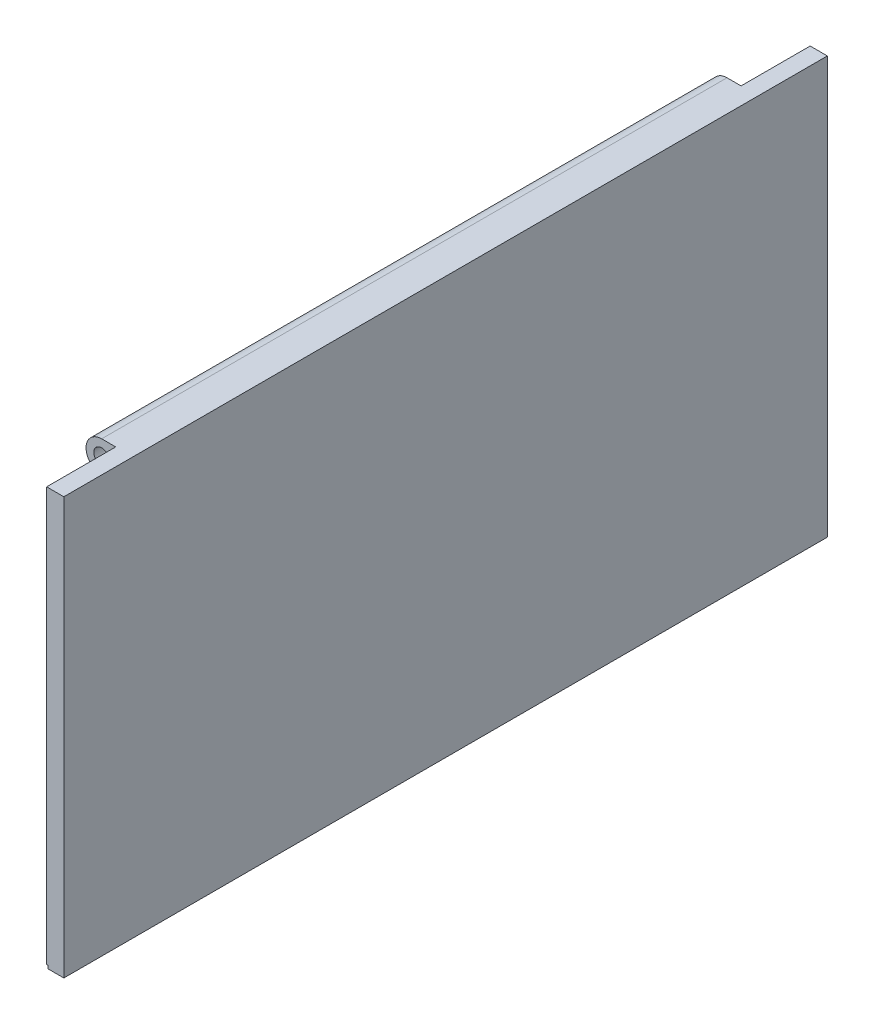
ISO-10303-21;
HEADER;
FILE_DESCRIPTION(('STEP AP214'),'2;1');
FILE_NAME('part.step','',(''),(''),'','','');
FILE_SCHEMA(('AUTOMOTIVE_DESIGN { 1 0 10303 214 1 1 1 1 }'));
ENDSEC;
DATA;
#1=APPLICATION_CONTEXT('core data for automotive mechanical design processes');
#2=APPLICATION_PROTOCOL_DEFINITION('international standard','automotive_design',2000,#1);
#3=PRODUCT_CONTEXT('',#1,'mechanical');
#4=PRODUCT('Part','Part','',(#3));
#5=PRODUCT_RELATED_PRODUCT_CATEGORY('part','',(#4));
#6=PRODUCT_DEFINITION_FORMATION('','',#4);
#7=PRODUCT_DEFINITION_CONTEXT('part definition',#1,'design');
#8=PRODUCT_DEFINITION('design','',#6,#7);
#9=PRODUCT_DEFINITION_SHAPE('','',#8);
#10=(LENGTH_UNIT() NAMED_UNIT(*) SI_UNIT(.MILLI.,.METRE.));
#11=(NAMED_UNIT(*) PLANE_ANGLE_UNIT() SI_UNIT($,.RADIAN.));
#12=(NAMED_UNIT(*) SI_UNIT($,.STERADIAN.) SOLID_ANGLE_UNIT());
#13=UNCERTAINTY_MEASURE_WITH_UNIT(LENGTH_MEASURE(1.E-05),#10,'distance_accuracy_value','');
#14=(GEOMETRIC_REPRESENTATION_CONTEXT(3) GLOBAL_UNCERTAINTY_ASSIGNED_CONTEXT((#13)) GLOBAL_UNIT_ASSIGNED_CONTEXT((#10,
#11,#12)) REPRESENTATION_CONTEXT('',''));
#15=CARTESIAN_POINT('',(0.,0.,0.));
#16=DIRECTION('',(0.,0.,1.));
#17=DIRECTION('',(1.,0.,0.));
#18=AXIS2_PLACEMENT_3D('',#15,#16,#17);
#19=CARTESIAN_POINT('',(0.,2.5,111.05));
#20=DIRECTION('',(0.,-1.,0.));
#21=DIRECTION('',(0.,0.,-1.));
#22=AXIS2_PLACEMENT_3D('',#19,#20,#21);
#23=PLANE('',#22);
#24=DIRECTION('',(-1.,0.,0.));
#25=VECTOR('',#24,1.);
#26=CARTESIAN_POINT('',(0.,2.5,100.));
#27=LINE('',#26,#25);
#28=CARTESIAN_POINT('',(2.25,2.5,100.));
#29=VERTEX_POINT('',#28);
#30=CARTESIAN_POINT('',(0.,2.5,100.));
#31=VERTEX_POINT('',#30);
#32=EDGE_CURVE('E148',#29,#31,#27,.T.);
#33=ORIENTED_EDGE('',*,*,#32,.F.);
#34=DIRECTION('',(0.,0.,1.));
#35=VECTOR('',#34,1.);
#36=CARTESIAN_POINT('',(2.25,2.5,-77.2571370775085));
#37=LINE('',#36,#35);
#38=CARTESIAN_POINT('',(2.25,2.5,111.05));
#39=VERTEX_POINT('',#38);
#40=EDGE_CURVE('E144',#29,#39,#37,.T.);
#41=ORIENTED_EDGE('',*,*,#40,.T.);
#42=DIRECTION('',(-1.,0.,0.));
#43=VECTOR('',#42,1.);
#44=CARTESIAN_POINT('',(0.,2.5,111.05));
#45=LINE('',#44,#43);
#46=CARTESIAN_POINT('',(5.,2.5,111.05));
#47=VERTEX_POINT('',#46);
#48=EDGE_CURVE('E166',#47,#39,#45,.T.);
#49=ORIENTED_EDGE('',*,*,#48,.F.);
#50=DIRECTION('',(0.,0.,-1.));
#51=VECTOR('',#50,1.);
#52=CARTESIAN_POINT('',(5.,2.5,111.05));
#53=LINE('',#52,#51);
#54=CARTESIAN_POINT('',(5.,2.5,-11.05));
#55=VERTEX_POINT('',#54);
#56=EDGE_CURVE('E168',#47,#55,#53,.T.);
#57=ORIENTED_EDGE('',*,*,#56,.T.);
#58=DIRECTION('',(-1.,0.,0.));
#59=VECTOR('',#58,1.);
#60=CARTESIAN_POINT('',(0.,2.5,-11.05));
#61=LINE('',#60,#59);
#62=CARTESIAN_POINT('',(2.25,2.5,-11.05));
#63=VERTEX_POINT('',#62);
#64=EDGE_CURVE('E162',#55,#63,#61,.T.);
#65=ORIENTED_EDGE('',*,*,#64,.T.);
#66=CARTESIAN_POINT('',(2.25,2.5,0.));
#67=VERTEX_POINT('',#66);
#68=EDGE_CURVE('E293',#63,#67,#37,.T.);
#69=ORIENTED_EDGE('',*,*,#68,.T.);
#70=DIRECTION('',(-1.,0.,0.));
#71=VECTOR('',#70,1.);
#72=CARTESIAN_POINT('',(0.,2.5,0.));
#73=LINE('',#72,#71);
#74=CARTESIAN_POINT('',(0.,2.5,0.));
#75=VERTEX_POINT('',#74);
#76=EDGE_CURVE('E202',#67,#75,#73,.T.);
#77=ORIENTED_EDGE('',*,*,#76,.T.);
#78=DIRECTION('',(0.,0.,-1.));
#79=VECTOR('',#78,1.);
#80=CARTESIAN_POINT('',(0.,2.5,100.));
#81=LINE('',#80,#79);
#82=EDGE_CURVE('E194',#31,#75,#81,.T.);
#83=ORIENTED_EDGE('',*,*,#82,.F.);
#84=EDGE_LOOP('',(#33,#41,#49,#57,#65,#69,#77,#83));
#85=FACE_BOUND('',#84,.T.);
#86=ADVANCED_FACE('F39',(#85),#23,.F.);
#87=CARTESIAN_POINT('',(0.,-2.5,111.05));
#88=DIRECTION('',(0.,1.,0.));
#89=DIRECTION('',(0.,0.,1.));
#90=AXIS2_PLACEMENT_3D('',#87,#88,#89);
#91=PLANE('',#90);
#92=DIRECTION('',(-1.,0.,0.));
#93=VECTOR('',#92,1.);
#94=CARTESIAN_POINT('',(2.5,-2.5,0.));
#95=LINE('',#94,#93);
#96=CARTESIAN_POINT('',(0.804642195809896,-2.5,0.));
#97=VERTEX_POINT('',#96);
#98=CARTESIAN_POINT('',(0.,-2.5,0.));
#99=VERTEX_POINT('',#98);
#100=EDGE_CURVE('E156',#97,#99,#95,.T.);
#101=ORIENTED_EDGE('',*,*,#100,.F.);
#102=DIRECTION('',(0.,0.,1.));
#103=VECTOR('',#102,1.);
#104=CARTESIAN_POINT('',(0.804642195809896,-2.5,111.05));
#105=LINE('',#104,#103);
#106=CARTESIAN_POINT('',(0.804642195809896,-2.5,100.));
#107=VERTEX_POINT('',#106);
#108=EDGE_CURVE('E206',#97,#107,#105,.T.);
#109=ORIENTED_EDGE('',*,*,#108,.T.);
#110=DIRECTION('',(1.,0.,0.));
#111=VECTOR('',#110,1.);
#112=CARTESIAN_POINT('',(2.5,-2.5,100.));
#113=LINE('',#112,#111);
#114=CARTESIAN_POINT('',(0.,-2.5,100.));
#115=VERTEX_POINT('',#114);
#116=EDGE_CURVE('E145',#115,#107,#113,.T.);
#117=ORIENTED_EDGE('',*,*,#116,.F.);
#118=DIRECTION('',(0.,0.,-1.));
#119=VECTOR('',#118,1.);
#120=CARTESIAN_POINT('',(0.,-2.5,100.));
#121=LINE('',#120,#119);
#122=EDGE_CURVE('E199',#115,#99,#121,.T.);
#123=ORIENTED_EDGE('',*,*,#122,.T.);
#124=EDGE_LOOP('',(#101,#109,#117,#123));
#125=FACE_BOUND('',#124,.T.);
#126=ADVANCED_FACE('F212',(#125),#91,.F.);
#127=CARTESIAN_POINT('',(0.,0.,111.05));
#128=DIRECTION('',(0.,0.,1.));
#129=DIRECTION('',(1.,0.,0.));
#130=AXIS2_PLACEMENT_3D('',#127,#128,#129);
#131=PLANE('',#130);
#132=DIRECTION('',(0.,1.,0.));
#133=VECTOR('',#132,1.);
#134=CARTESIAN_POINT('',(5.,2.5,111.05));
#135=LINE('',#134,#133);
#136=CARTESIAN_POINT('',(5.00000000000001,-64.15,111.05));
#137=VERTEX_POINT('',#136);
#138=EDGE_CURVE('E164',#137,#47,#135,.T.);
#139=ORIENTED_EDGE('',*,*,#138,.T.);
#140=ORIENTED_EDGE('',*,*,#48,.T.);
#141=DIRECTION('',(0.,-1.,0.));
#142=VECTOR('',#141,1.);
#143=CARTESIAN_POINT('',(2.25,2.5,111.05));
#144=LINE('',#143,#142);
#145=CARTESIAN_POINT('',(2.25000000000001,-63.65,111.05));
#146=VERTEX_POINT('',#145);
#147=EDGE_CURVE('E288',#39,#146,#144,.T.);
#148=ORIENTED_EDGE('',*,*,#147,.T.);
#149=DIRECTION('',(1.,0.,0.));
#150=VECTOR('',#149,1.);
#151=CARTESIAN_POINT('',(5.,-63.65,111.05));
#152=LINE('',#151,#150);
#153=CARTESIAN_POINT('',(2.50000000000001,-63.65,111.05));
#154=VERTEX_POINT('',#153);
#155=EDGE_CURVE('E291',#146,#154,#152,.T.);
#156=ORIENTED_EDGE('',*,*,#155,.T.);
#157=DIRECTION('',(0.,-1.,0.));
#158=VECTOR('',#157,1.);
#159=CARTESIAN_POINT('',(2.5,-2.5,111.05));
#160=LINE('',#159,#158);
#161=CARTESIAN_POINT('',(2.50000000000001,-64.15,111.05));
#162=VERTEX_POINT('',#161);
#163=EDGE_CURVE('E159',#154,#162,#160,.T.);
#164=ORIENTED_EDGE('',*,*,#163,.T.);
#165=DIRECTION('',(1.,0.,0.));
#166=VECTOR('',#165,1.);
#167=CARTESIAN_POINT('',(2.50000000000001,-64.15,111.05));
#168=LINE('',#167,#166);
#169=EDGE_CURVE('E161',#162,#137,#168,.T.);
#170=ORIENTED_EDGE('',*,*,#169,.T.);
#171=EDGE_LOOP('',(#139,#140,#148,#156,#164,#170));
#172=FACE_BOUND('',#171,.T.);
#173=ADVANCED_FACE('F237',(#172),#131,.T.);
#174=CARTESIAN_POINT('',(0.,0.,-11.05));
#175=DIRECTION('',(0.,0.,1.));
#176=DIRECTION('',(1.,0.,0.));
#177=AXIS2_PLACEMENT_3D('',#174,#175,#176);
#178=PLANE('',#177);
#179=DIRECTION('',(0.,-1.,0.));
#180=VECTOR('',#179,1.);
#181=CARTESIAN_POINT('',(2.5,-2.5,-11.05));
#182=LINE('',#181,#180);
#183=CARTESIAN_POINT('',(2.5,-63.65,-11.05));
#184=VERTEX_POINT('',#183);
#185=CARTESIAN_POINT('',(2.50000000000001,-64.15,-11.05));
#186=VERTEX_POINT('',#185);
#187=EDGE_CURVE('E158',#184,#186,#182,.T.);
#188=ORIENTED_EDGE('',*,*,#187,.F.);
#189=DIRECTION('',(-1.,0.,0.));
#190=VECTOR('',#189,1.);
#191=CARTESIAN_POINT('',(5.,-63.65,-11.05));
#192=LINE('',#191,#190);
#193=CARTESIAN_POINT('',(2.25000000000001,-63.65,-11.05));
#194=VERTEX_POINT('',#193);
#195=EDGE_CURVE('E151',#184,#194,#192,.T.);
#196=ORIENTED_EDGE('',*,*,#195,.T.);
#197=DIRECTION('',(0.,1.,0.));
#198=VECTOR('',#197,1.);
#199=CARTESIAN_POINT('',(2.25,2.5,-11.05));
#200=LINE('',#199,#198);
#201=EDGE_CURVE('E283',#194,#63,#200,.T.);
#202=ORIENTED_EDGE('',*,*,#201,.T.);
#203=ORIENTED_EDGE('',*,*,#64,.F.);
#204=DIRECTION('',(0.,1.,0.));
#205=VECTOR('',#204,1.);
#206=CARTESIAN_POINT('',(5.,2.5,-11.05));
#207=LINE('',#206,#205);
#208=CARTESIAN_POINT('',(5.00000000000001,-64.15,-11.05));
#209=VERTEX_POINT('',#208);
#210=EDGE_CURVE('E172',#209,#55,#207,.T.);
#211=ORIENTED_EDGE('',*,*,#210,.F.);
#212=DIRECTION('',(1.,0.,0.));
#213=VECTOR('',#212,1.);
#214=CARTESIAN_POINT('',(2.50000000000001,-64.15,-11.05));
#215=LINE('',#214,#213);
#216=EDGE_CURVE('E170',#186,#209,#215,.T.);
#217=ORIENTED_EDGE('',*,*,#216,.F.);
#218=EDGE_LOOP('',(#188,#196,#202,#203,#211,#217));
#219=FACE_BOUND('',#218,.T.);
#220=ADVANCED_FACE('F241',(#219),#178,.F.);
#221=CARTESIAN_POINT('',(0.,0.,100.));
#222=DIRECTION('',(0.,0.,-1.));
#223=DIRECTION('',(-1.,0.,0.));
#224=AXIS2_PLACEMENT_3D('',#221,#222,#223);
#225=CYLINDRICAL_SURFACE('',#224,2.5);
#226=ORIENTED_EDGE('',*,*,#122,.F.);
#227=CARTESIAN_POINT('',(0.,0.,100.));
#228=DIRECTION('',(0.,0.,1.));
#229=DIRECTION('',(1.,0.,0.));
#230=AXIS2_PLACEMENT_3D('',#227,#228,#229);
#231=CIRCLE('',#230,2.5);
#232=EDGE_CURVE('E191',#31,#115,#231,.T.);
#233=ORIENTED_EDGE('',*,*,#232,.F.);
#234=ORIENTED_EDGE('',*,*,#82,.T.);
#235=CARTESIAN_POINT('',(0.,0.,0.));
#236=DIRECTION('',(0.,0.,1.));
#237=DIRECTION('',(1.,0.,0.));
#238=AXIS2_PLACEMENT_3D('',#235,#236,#237);
#239=CIRCLE('',#238,2.5);
#240=EDGE_CURVE('E188',#75,#99,#239,.T.);
#241=ORIENTED_EDGE('',*,*,#240,.T.);
#242=EDGE_LOOP('',(#226,#233,#234,#241));
#243=FACE_BOUND('',#242,.T.);
#244=ADVANCED_FACE('F219',(#243),#225,.T.);
#245=CARTESIAN_POINT('',(0.,0.,100.));
#246=DIRECTION('',(0.,0.,1.));
#247=DIRECTION('',(1.,0.,0.));
#248=AXIS2_PLACEMENT_3D('',#245,#246,#247);
#249=PLANE('',#248);
#250=ORIENTED_EDGE('',*,*,#116,.T.);
#251=CARTESIAN_POINT('',(0.804642195809896,-0.5,100.));
#252=DIRECTION('',(0.,0.,1.));
#253=DIRECTION('',(1.,0.,0.));
#254=AXIS2_PLACEMENT_3D('',#251,#252,#253);
#255=CIRCLE('',#254,2.);
#256=CARTESIAN_POINT('',(2.20271594078655,-1.93017124974842,100.));
#257=VERTEX_POINT('',#256);
#258=EDGE_CURVE('E61',#107,#257,#255,.T.);
#259=ORIENTED_EDGE('',*,*,#258,.T.);
#260=DIRECTION('',(-0.715085624874211,-0.699036872488326,0.));
#261=VECTOR('',#260,1.);
#262=CARTESIAN_POINT('',(2.25,-1.88394839234314,100.));
#263=LINE('',#262,#261);
#264=CARTESIAN_POINT('',(2.25,-1.88394839234314,100.));
#265=VERTEX_POINT('',#264);
#266=EDGE_CURVE('E127',#265,#257,#263,.T.);
#267=ORIENTED_EDGE('',*,*,#266,.F.);
#268=DIRECTION('',(0.,-1.,0.));
#269=VECTOR('',#268,1.);
#270=CARTESIAN_POINT('',(2.25,0.,100.));
#271=LINE('',#270,#269);
#272=EDGE_CURVE('E136',#29,#265,#271,.T.);
#273=ORIENTED_EDGE('',*,*,#272,.F.);
#274=ORIENTED_EDGE('',*,*,#32,.T.);
#275=ORIENTED_EDGE('',*,*,#232,.T.);
#276=EDGE_LOOP('',(#250,#259,#267,#273,#274,#275));
#277=FACE_BOUND('',#276,.T.);
#278=CARTESIAN_POINT('',(0.,0.,100.));
#279=DIRECTION('',(0.,0.,1.));
#280=DIRECTION('',(1.,0.,0.));
#281=AXIS2_PLACEMENT_3D('',#278,#279,#280);
#282=CIRCLE('',#281,1.25);
#283=CARTESIAN_POINT('',(1.25,0.,100.));
#284=VERTEX_POINT('',#283);
#285=EDGE_CURVE('E185',#284,#284,#282,.T.);
#286=ORIENTED_EDGE('',*,*,#285,.F.);
#287=EDGE_LOOP('',(#286));
#288=FACE_BOUND('',#287,.T.);
#289=ADVANCED_FACE('F134',(#277,#288),#249,.T.);
#290=CARTESIAN_POINT('',(0.,0.,0.));
#291=DIRECTION('',(0.,0.,1.));
#292=DIRECTION('',(1.,0.,0.));
#293=AXIS2_PLACEMENT_3D('',#290,#291,#292);
#294=PLANE('',#293);
#295=DIRECTION('',(-0.715085624874211,-0.699036872488326,0.));
#296=VECTOR('',#295,1.);
#297=CARTESIAN_POINT('',(2.04119981445789,-2.08806245029531,0.));
#298=LINE('',#297,#296);
#299=CARTESIAN_POINT('',(2.25,-1.88394839234314,0.));
#300=VERTEX_POINT('',#299);
#301=CARTESIAN_POINT('',(2.20271594078655,-1.93017124974842,0.));
#302=VERTEX_POINT('',#301);
#303=EDGE_CURVE('E128',#300,#302,#298,.T.);
#304=ORIENTED_EDGE('',*,*,#303,.T.);
#305=CARTESIAN_POINT('',(0.804642195809896,-0.5,0.));
#306=DIRECTION('',(0.,0.,1.));
#307=DIRECTION('',(1.,0.,0.));
#308=AXIS2_PLACEMENT_3D('',#305,#306,#307);
#309=CIRCLE('',#308,2.);
#310=EDGE_CURVE('E11',#302,#97,#309,.F.);
#311=ORIENTED_EDGE('',*,*,#310,.T.);
#312=ORIENTED_EDGE('',*,*,#100,.T.);
#313=ORIENTED_EDGE('',*,*,#240,.F.);
#314=ORIENTED_EDGE('',*,*,#76,.F.);
#315=DIRECTION('',(0.,-1.,0.));
#316=VECTOR('',#315,1.);
#317=CARTESIAN_POINT('',(2.25,0.,0.));
#318=LINE('',#317,#316);
#319=EDGE_CURVE('E204',#67,#300,#318,.T.);
#320=ORIENTED_EDGE('',*,*,#319,.T.);
#321=EDGE_LOOP('',(#304,#311,#312,#313,#314,#320));
#322=FACE_BOUND('',#321,.T.);
#323=CARTESIAN_POINT('',(0.,0.,0.));
#324=DIRECTION('',(0.,0.,1.));
#325=DIRECTION('',(1.,0.,0.));
#326=AXIS2_PLACEMENT_3D('',#323,#324,#325);
#327=CIRCLE('',#326,1.25);
#328=CARTESIAN_POINT('',(1.25,0.,0.));
#329=VERTEX_POINT('',#328);
#330=EDGE_CURVE('E184',#329,#329,#327,.T.);
#331=ORIENTED_EDGE('',*,*,#330,.T.);
#332=EDGE_LOOP('',(#331));
#333=FACE_BOUND('',#332,.T.);
#334=ADVANCED_FACE('F222',(#322,#333),#294,.F.);
#335=CARTESIAN_POINT('',(0.,0.,100.));
#336=DIRECTION('',(0.,0.,-1.));
#337=DIRECTION('',(-1.,0.,0.));
#338=AXIS2_PLACEMENT_3D('',#335,#336,#337);
#339=CYLINDRICAL_SURFACE('',#338,1.25);
#340=ORIENTED_EDGE('',*,*,#285,.T.);
#341=EDGE_LOOP('',(#340));
#342=FACE_BOUND('',#341,.T.);
#343=ORIENTED_EDGE('',*,*,#330,.F.);
#344=EDGE_LOOP('',(#343));
#345=FACE_BOUND('',#344,.T.);
#346=ADVANCED_FACE('F254',(#342,#345),#339,.F.);
#347=CARTESIAN_POINT('',(2.5,-2.5,111.05));
#348=DIRECTION('',(1.,0.,0.));
#349=DIRECTION('',(0.,1.,0.));
#350=AXIS2_PLACEMENT_3D('',#347,#348,#349);
#351=PLANE('',#350);
#352=ORIENTED_EDGE('',*,*,#163,.F.);
#353=DIRECTION('',(0.,0.,-1.));
#354=VECTOR('',#353,1.);
#355=CARTESIAN_POINT('',(2.50000000000001,-63.65,111.05));
#356=LINE('',#355,#354);
#357=EDGE_CURVE('E146',#154,#184,#356,.T.);
#358=ORIENTED_EDGE('',*,*,#357,.T.);
#359=ORIENTED_EDGE('',*,*,#187,.T.);
#360=DIRECTION('',(0.,0.,-1.));
#361=VECTOR('',#360,1.);
#362=CARTESIAN_POINT('',(2.50000000000001,-64.15,111.05));
#363=LINE('',#362,#361);
#364=EDGE_CURVE('E181',#162,#186,#363,.T.);
#365=ORIENTED_EDGE('',*,*,#364,.F.);
#366=EDGE_LOOP('',(#352,#358,#359,#365));
#367=FACE_BOUND('',#366,.T.);
#368=ADVANCED_FACE('F251',(#367),#351,.F.);
#369=CARTESIAN_POINT('',(2.50000000000001,-64.15,111.05));
#370=DIRECTION('',(0.,1.,0.));
#371=DIRECTION('',(0.,0.,1.));
#372=AXIS2_PLACEMENT_3D('',#369,#370,#371);
#373=PLANE('',#372);
#374=ORIENTED_EDGE('',*,*,#216,.T.);
#375=DIRECTION('',(0.,0.,-1.));
#376=VECTOR('',#375,1.);
#377=CARTESIAN_POINT('',(5.00000000000001,-64.15,111.05));
#378=LINE('',#377,#376);
#379=EDGE_CURVE('E178',#137,#209,#378,.T.);
#380=ORIENTED_EDGE('',*,*,#379,.F.);
#381=ORIENTED_EDGE('',*,*,#169,.F.);
#382=ORIENTED_EDGE('',*,*,#364,.T.);
#383=EDGE_LOOP('',(#374,#380,#381,#382));
#384=FACE_BOUND('',#383,.T.);
#385=ADVANCED_FACE('F247',(#384),#373,.F.);
#386=CARTESIAN_POINT('',(5.,2.5,111.05));
#387=DIRECTION('',(-1.,0.,0.));
#388=DIRECTION('',(0.,-1.,0.));
#389=AXIS2_PLACEMENT_3D('',#386,#387,#388);
#390=PLANE('',#389);
#391=ORIENTED_EDGE('',*,*,#210,.T.);
#392=ORIENTED_EDGE('',*,*,#56,.F.);
#393=ORIENTED_EDGE('',*,*,#138,.F.);
#394=ORIENTED_EDGE('',*,*,#379,.T.);
#395=EDGE_LOOP('',(#391,#392,#393,#394));
#396=FACE_BOUND('',#395,.T.);
#397=ADVANCED_FACE('F243',(#396),#390,.F.);
#398=CARTESIAN_POINT('',(5.,-63.65,-77.2571370775085));
#399=DIRECTION('',(0.,-1.,0.));
#400=DIRECTION('',(0.,0.,-1.));
#401=AXIS2_PLACEMENT_3D('',#398,#399,#400);
#402=PLANE('',#401);
#403=ORIENTED_EDGE('',*,*,#357,.F.);
#404=ORIENTED_EDGE('',*,*,#155,.F.);
#405=DIRECTION('',(0.,0.,1.));
#406=VECTOR('',#405,1.);
#407=CARTESIAN_POINT('',(2.25000000000001,-63.65,-77.2571370775085));
#408=LINE('',#407,#406);
#409=EDGE_CURVE('E282',#194,#146,#408,.T.);
#410=ORIENTED_EDGE('',*,*,#409,.F.);
#411=ORIENTED_EDGE('',*,*,#195,.F.);
#412=EDGE_LOOP('',(#403,#404,#410,#411));
#413=FACE_BOUND('',#412,.T.);
#414=ADVANCED_FACE('F246',(#413),#402,.T.);
#415=CARTESIAN_POINT('',(2.25,2.5,-77.2571370775085));
#416=DIRECTION('',(-1.,0.,0.));
#417=DIRECTION('',(0.,-1.,0.));
#418=AXIS2_PLACEMENT_3D('',#415,#416,#417);
#419=PLANE('',#418);
#420=ORIENTED_EDGE('',*,*,#68,.F.);
#421=ORIENTED_EDGE('',*,*,#201,.F.);
#422=ORIENTED_EDGE('',*,*,#409,.T.);
#423=ORIENTED_EDGE('',*,*,#147,.F.);
#424=ORIENTED_EDGE('',*,*,#40,.F.);
#425=ORIENTED_EDGE('',*,*,#272,.T.);
#426=DIRECTION('',(0.,0.,1.));
#427=VECTOR('',#426,1.);
#428=CARTESIAN_POINT('',(2.25,-1.88394839234314,-200.));
#429=LINE('',#428,#427);
#430=EDGE_CURVE('E125',#300,#265,#429,.T.);
#431=ORIENTED_EDGE('',*,*,#430,.F.);
#432=ORIENTED_EDGE('',*,*,#319,.F.);
#433=EDGE_LOOP('',(#420,#421,#422,#423,#424,#425,#431,#432));
#434=FACE_BOUND('',#433,.T.);
#435=ADVANCED_FACE('F141',(#434),#419,.T.);
#436=CARTESIAN_POINT('',(2.25,-1.88394839234314,-200.));
#437=DIRECTION('',(-0.699036872488326,0.715085624874211,0.));
#438=DIRECTION('',(-0.715085624874211,-0.699036872488326,0.));
#439=AXIS2_PLACEMENT_3D('',#436,#437,#438);
#440=PLANE('',#439);
#441=ORIENTED_EDGE('',*,*,#266,.T.);
#442=DIRECTION('',(0.,0.,1.));
#443=VECTOR('',#442,1.);
#444=CARTESIAN_POINT('',(2.20271594078655,-1.93017124974842,-200.));
#445=LINE('',#444,#443);
#446=EDGE_CURVE('E47',#257,#302,#445,.F.);
#447=ORIENTED_EDGE('',*,*,#446,.T.);
#448=ORIENTED_EDGE('',*,*,#303,.F.);
#449=ORIENTED_EDGE('',*,*,#430,.T.);
#450=EDGE_LOOP('',(#441,#447,#448,#449));
#451=FACE_BOUND('',#450,.T.);
#452=ADVANCED_FACE('F126',(#451),#440,.F.);
#453=CARTESIAN_POINT('',(0.804642195809896,-0.5,111.05));
#454=DIRECTION('',(0.,0.,1.));
#455=DIRECTION('',(1.,0.,0.));
#456=AXIS2_PLACEMENT_3D('',#453,#454,#455);
#457=CYLINDRICAL_SURFACE('',#456,2.);
#458=ORIENTED_EDGE('',*,*,#310,.F.);
#459=ORIENTED_EDGE('',*,*,#446,.F.);
#460=ORIENTED_EDGE('',*,*,#258,.F.);
#461=ORIENTED_EDGE('',*,*,#108,.F.);
#462=EDGE_LOOP('',(#458,#459,#460,#461));
#463=FACE_BOUND('',#462,.T.);
#464=ADVANCED_FACE('F41',(#463),#457,.T.);
#465=CLOSED_SHELL('',(#86,#126,#173,#220,#244,#289,#334,#346,#368,#385,#397,#414,#435,#452,#464));
#466=MANIFOLD_SOLID_BREP('B2',#465);
#467=ADVANCED_BREP_SHAPE_REPRESENTATION('',(#18,#466),#14);
#468=SHAPE_DEFINITION_REPRESENTATION(#9,#467);
ENDSEC;
END-ISO-10303-21;
